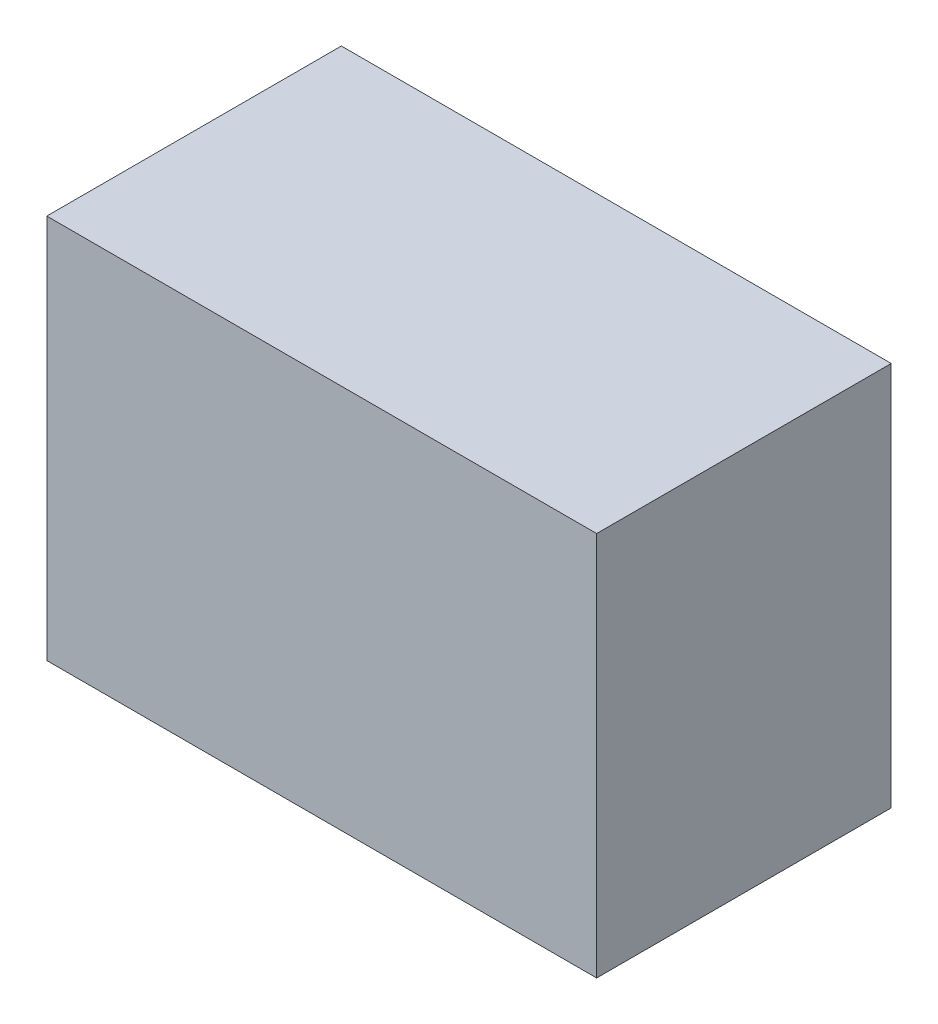
ISO-10303-21;
HEADER;
FILE_DESCRIPTION(('STEP AP214'),'2;1');
FILE_NAME('part.step','',(''),(''),'','','');
FILE_SCHEMA(('AUTOMOTIVE_DESIGN { 1 0 10303 214 1 1 1 1 }'));
ENDSEC;
DATA;
#1=APPLICATION_CONTEXT('core data for automotive mechanical design processes');
#2=APPLICATION_PROTOCOL_DEFINITION('international standard','automotive_design',2000,#1);
#3=PRODUCT_CONTEXT('',#1,'mechanical');
#4=PRODUCT('Part','Part','',(#3));
#5=PRODUCT_RELATED_PRODUCT_CATEGORY('part','',(#4));
#6=PRODUCT_DEFINITION_FORMATION('','',#4);
#7=PRODUCT_DEFINITION_CONTEXT('part definition',#1,'design');
#8=PRODUCT_DEFINITION('design','',#6,#7);
#9=PRODUCT_DEFINITION_SHAPE('','',#8);
#10=(LENGTH_UNIT() NAMED_UNIT(*) SI_UNIT(.MILLI.,.METRE.));
#11=(NAMED_UNIT(*) PLANE_ANGLE_UNIT() SI_UNIT($,.RADIAN.));
#12=(NAMED_UNIT(*) SI_UNIT($,.STERADIAN.) SOLID_ANGLE_UNIT());
#13=UNCERTAINTY_MEASURE_WITH_UNIT(LENGTH_MEASURE(1.E-05),#10,'distance_accuracy_value','');
#14=(GEOMETRIC_REPRESENTATION_CONTEXT(3) GLOBAL_UNCERTAINTY_ASSIGNED_CONTEXT((#13)) GLOBAL_UNIT_ASSIGNED_CONTEXT((#10,
#11,#12)) REPRESENTATION_CONTEXT('',''));
#15=CARTESIAN_POINT('',(0.,0.,0.));
#16=DIRECTION('',(0.,0.,1.));
#17=DIRECTION('',(1.,0.,0.));
#18=AXIS2_PLACEMENT_3D('',#15,#16,#17);
#19=CARTESIAN_POINT('',(70.,49.,-37.5));
#20=DIRECTION('',(-1.,0.,0.));
#21=DIRECTION('',(0.,0.,1.));
#22=AXIS2_PLACEMENT_3D('',#19,#20,#21);
#23=PLANE('',#22);
#24=DIRECTION('',(0.,0.,-1.));
#25=VECTOR('',#24,1.);
#26=CARTESIAN_POINT('',(70.,-49.,-37.5));
#27=LINE('',#26,#25);
#28=CARTESIAN_POINT('',(70.,-49.,37.5));
#29=VERTEX_POINT('',#28);
#30=CARTESIAN_POINT('',(70.,-49.,-37.5));
#31=VERTEX_POINT('',#30);
#32=EDGE_CURVE('E121',#29,#31,#27,.T.);
#33=ORIENTED_EDGE('',*,*,#32,.T.);
#34=DIRECTION('',(0.,-1.,0.));
#35=VECTOR('',#34,1.);
#36=CARTESIAN_POINT('',(70.,49.,-37.5));
#37=LINE('',#36,#35);
#38=CARTESIAN_POINT('',(70.,49.,-37.5));
#39=VERTEX_POINT('',#38);
#40=EDGE_CURVE('E11',#39,#31,#37,.T.);
#41=ORIENTED_EDGE('',*,*,#40,.F.);
#42=DIRECTION('',(0.,0.,-1.));
#43=VECTOR('',#42,1.);
#44=CARTESIAN_POINT('',(70.,49.,-37.5));
#45=LINE('',#44,#43);
#46=CARTESIAN_POINT('',(70.,49.,37.5));
#47=VERTEX_POINT('',#46);
#48=EDGE_CURVE('E105',#47,#39,#45,.T.);
#49=ORIENTED_EDGE('',*,*,#48,.F.);
#50=DIRECTION('',(0.,-1.,0.));
#51=VECTOR('',#50,1.);
#52=CARTESIAN_POINT('',(70.,49.,37.5));
#53=LINE('',#52,#51);
#54=EDGE_CURVE('E117',#47,#29,#53,.T.);
#55=ORIENTED_EDGE('',*,*,#54,.T.);
#56=EDGE_LOOP('',(#33,#41,#49,#55));
#57=FACE_BOUND('',#56,.T.);
#58=ADVANCED_FACE('F53',(#57),#23,.F.);
#59=CARTESIAN_POINT('',(-70.,49.,-37.5));
#60=DIRECTION('',(0.,0.,1.));
#61=DIRECTION('',(1.,0.,0.));
#62=AXIS2_PLACEMENT_3D('',#59,#60,#61);
#63=PLANE('',#62);
#64=DIRECTION('',(-1.,0.,0.));
#65=VECTOR('',#64,1.);
#66=CARTESIAN_POINT('',(-70.,-49.,-37.5));
#67=LINE('',#66,#65);
#68=CARTESIAN_POINT('',(-70.,-49.,-37.5));
#69=VERTEX_POINT('',#68);
#70=EDGE_CURVE('E110',#31,#69,#67,.T.);
#71=ORIENTED_EDGE('',*,*,#70,.T.);
#72=DIRECTION('',(0.,-1.,0.));
#73=VECTOR('',#72,1.);
#74=CARTESIAN_POINT('',(-70.,49.,-37.5));
#75=LINE('',#74,#73);
#76=CARTESIAN_POINT('',(-70.,49.,-37.5));
#77=VERTEX_POINT('',#76);
#78=EDGE_CURVE('E62',#77,#69,#75,.T.);
#79=ORIENTED_EDGE('',*,*,#78,.F.);
#80=DIRECTION('',(-1.,0.,0.));
#81=VECTOR('',#80,1.);
#82=CARTESIAN_POINT('',(-70.,49.,-37.5));
#83=LINE('',#82,#81);
#84=EDGE_CURVE('E100',#39,#77,#83,.T.);
#85=ORIENTED_EDGE('',*,*,#84,.F.);
#86=ORIENTED_EDGE('',*,*,#40,.T.);
#87=EDGE_LOOP('',(#71,#79,#85,#86));
#88=FACE_BOUND('',#87,.T.);
#89=ADVANCED_FACE('F109',(#88),#63,.F.);
#90=CARTESIAN_POINT('',(-70.,49.,-37.5));
#91=DIRECTION('',(1.,0.,0.));
#92=DIRECTION('',(0.,0.,-1.));
#93=AXIS2_PLACEMENT_3D('',#90,#91,#92);
#94=PLANE('',#93);
#95=DIRECTION('',(0.,0.,1.));
#96=VECTOR('',#95,1.);
#97=CARTESIAN_POINT('',(-70.,-49.,-37.5));
#98=LINE('',#97,#96);
#99=CARTESIAN_POINT('',(-70.,-49.,37.5));
#100=VERTEX_POINT('',#99);
#101=EDGE_CURVE('E87',#69,#100,#98,.T.);
#102=ORIENTED_EDGE('',*,*,#101,.T.);
#103=DIRECTION('',(0.,-1.,0.));
#104=VECTOR('',#103,1.);
#105=CARTESIAN_POINT('',(-70.,49.,37.5));
#106=LINE('',#105,#104);
#107=CARTESIAN_POINT('',(-70.,49.,37.5));
#108=VERTEX_POINT('',#107);
#109=EDGE_CURVE('E112',#108,#100,#106,.T.);
#110=ORIENTED_EDGE('',*,*,#109,.F.);
#111=DIRECTION('',(0.,0.,1.));
#112=VECTOR('',#111,1.);
#113=CARTESIAN_POINT('',(-70.,49.,-37.5));
#114=LINE('',#113,#112);
#115=EDGE_CURVE('E103',#77,#108,#114,.T.);
#116=ORIENTED_EDGE('',*,*,#115,.F.);
#117=ORIENTED_EDGE('',*,*,#78,.T.);
#118=EDGE_LOOP('',(#102,#110,#116,#117));
#119=FACE_BOUND('',#118,.T.);
#120=ADVANCED_FACE('F113',(#119),#94,.F.);
#121=CARTESIAN_POINT('',(-70.,49.,37.5));
#122=DIRECTION('',(0.,0.,-1.));
#123=DIRECTION('',(-1.,0.,0.));
#124=AXIS2_PLACEMENT_3D('',#121,#122,#123);
#125=PLANE('',#124);
#126=DIRECTION('',(1.,0.,0.));
#127=VECTOR('',#126,1.);
#128=CARTESIAN_POINT('',(-70.,-49.,37.5));
#129=LINE('',#128,#127);
#130=EDGE_CURVE('E93',#100,#29,#129,.T.);
#131=ORIENTED_EDGE('',*,*,#130,.T.);
#132=ORIENTED_EDGE('',*,*,#54,.F.);
#133=DIRECTION('',(1.,0.,0.));
#134=VECTOR('',#133,1.);
#135=CARTESIAN_POINT('',(-70.,49.,37.5));
#136=LINE('',#135,#134);
#137=EDGE_CURVE('E70',#108,#47,#136,.T.);
#138=ORIENTED_EDGE('',*,*,#137,.F.);
#139=ORIENTED_EDGE('',*,*,#109,.T.);
#140=EDGE_LOOP('',(#131,#132,#138,#139));
#141=FACE_BOUND('',#140,.T.);
#142=ADVANCED_FACE('F134',(#141),#125,.F.);
#143=CARTESIAN_POINT('',(0.,49.,0.));
#144=DIRECTION('',(0.,1.,0.));
#145=DIRECTION('',(0.,0.,1.));
#146=AXIS2_PLACEMENT_3D('',#143,#144,#145);
#147=PLANE('',#146);
#148=ORIENTED_EDGE('',*,*,#48,.T.);
#149=ORIENTED_EDGE('',*,*,#84,.T.);
#150=ORIENTED_EDGE('',*,*,#115,.T.);
#151=ORIENTED_EDGE('',*,*,#137,.T.);
#152=EDGE_LOOP('',(#148,#149,#150,#151));
#153=FACE_BOUND('',#152,.T.);
#154=ADVANCED_FACE('F101',(#153),#147,.T.);
#155=CARTESIAN_POINT('',(0.,-49.,0.));
#156=DIRECTION('',(0.,1.,0.));
#157=DIRECTION('',(0.,0.,1.));
#158=AXIS2_PLACEMENT_3D('',#155,#156,#157);
#159=PLANE('',#158);
#160=ORIENTED_EDGE('',*,*,#32,.F.);
#161=ORIENTED_EDGE('',*,*,#130,.F.);
#162=ORIENTED_EDGE('',*,*,#101,.F.);
#163=ORIENTED_EDGE('',*,*,#70,.F.);
#164=EDGE_LOOP('',(#160,#161,#162,#163));
#165=FACE_BOUND('',#164,.T.);
#166=ADVANCED_FACE('F137',(#165),#159,.F.);
#167=CLOSED_SHELL('',(#58,#89,#120,#142,#154,#166));
#168=MANIFOLD_SOLID_BREP('B2',#167);
#169=ADVANCED_BREP_SHAPE_REPRESENTATION('',(#18,#168),#14);
#170=SHAPE_DEFINITION_REPRESENTATION(#9,#169);
ENDSEC;
END-ISO-10303-21;
